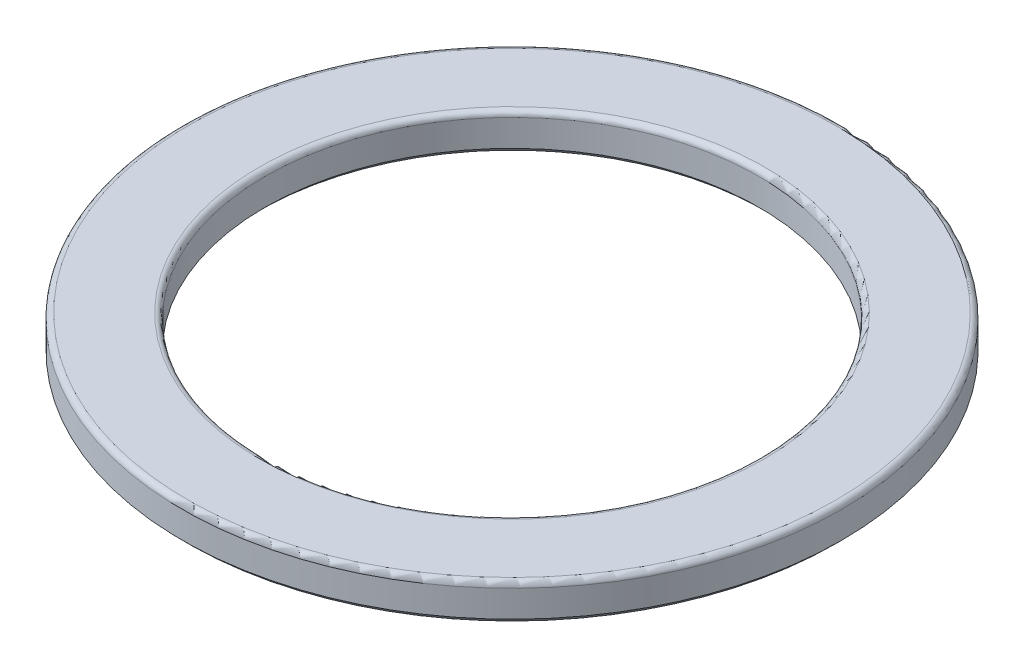
ISO-10303-21;
HEADER;
FILE_DESCRIPTION(('STEP AP214'),'2;1');
FILE_NAME('part.step','',(''),(''),'','','');
FILE_SCHEMA(('AUTOMOTIVE_DESIGN { 1 0 10303 214 1 1 1 1 }'));
ENDSEC;
DATA;
#1=APPLICATION_CONTEXT('core data for automotive mechanical design processes');
#2=APPLICATION_PROTOCOL_DEFINITION('international standard','automotive_design',2000,#1);
#3=PRODUCT_CONTEXT('',#1,'mechanical');
#4=PRODUCT('Part','Part','',(#3));
#5=PRODUCT_RELATED_PRODUCT_CATEGORY('part','',(#4));
#6=PRODUCT_DEFINITION_FORMATION('','',#4);
#7=PRODUCT_DEFINITION_CONTEXT('part definition',#1,'design');
#8=PRODUCT_DEFINITION('design','',#6,#7);
#9=PRODUCT_DEFINITION_SHAPE('','',#8);
#10=(LENGTH_UNIT() NAMED_UNIT(*) SI_UNIT(.MILLI.,.METRE.));
#11=(NAMED_UNIT(*) PLANE_ANGLE_UNIT() SI_UNIT($,.RADIAN.));
#12=(NAMED_UNIT(*) SI_UNIT($,.STERADIAN.) SOLID_ANGLE_UNIT());
#13=UNCERTAINTY_MEASURE_WITH_UNIT(LENGTH_MEASURE(1.E-05),#10,'distance_accuracy_value','');
#14=(GEOMETRIC_REPRESENTATION_CONTEXT(3) GLOBAL_UNCERTAINTY_ASSIGNED_CONTEXT((#13)) GLOBAL_UNIT_ASSIGNED_CONTEXT((#10,
#11,#12)) REPRESENTATION_CONTEXT('',''));
#15=CARTESIAN_POINT('',(0.,0.,0.));
#16=DIRECTION('',(0.,0.,1.));
#17=DIRECTION('',(1.,0.,0.));
#18=AXIS2_PLACEMENT_3D('',#15,#16,#17);
#19=CARTESIAN_POINT('',(52.5,22.,0.));
#20=DIRECTION('',(0.,1.,0.));
#21=DIRECTION('',(-1.,0.,0.));
#22=AXIS2_PLACEMENT_3D('',#19,#20,#21);
#23=PLANE('',#22);
#24=CARTESIAN_POINT('',(0.,22.,0.));
#25=DIRECTION('',(0.,-1.,0.));
#26=DIRECTION('',(1.,0.,0.));
#27=AXIS2_PLACEMENT_3D('',#24,#25,#26);
#28=CIRCLE('',#27,46.);
#29=CARTESIAN_POINT('',(46.,22.,0.));
#30=VERTEX_POINT('',#29);
#31=EDGE_CURVE('E11',#30,#30,#28,.T.);
#32=ORIENTED_EDGE('',*,*,#31,.T.);
#33=EDGE_LOOP('',(#32));
#34=FACE_BOUND('',#33,.T.);
#35=CARTESIAN_POINT('',(0.,22.,0.));
#36=DIRECTION('',(0.,-1.,0.));
#37=DIRECTION('',(1.,0.,0.));
#38=AXIS2_PLACEMENT_3D('',#35,#36,#37);
#39=CIRCLE('',#38,59.);
#40=CARTESIAN_POINT('',(59.,22.,0.));
#41=VERTEX_POINT('',#40);
#42=EDGE_CURVE('E49',#41,#41,#39,.T.);
#43=ORIENTED_EDGE('',*,*,#42,.F.);
#44=EDGE_LOOP('',(#43));
#45=FACE_BOUND('',#44,.T.);
#46=ADVANCED_FACE('F16',(#34,#45),#23,.T.);
#47=CARTESIAN_POINT('',(0.,21.,0.));
#48=DIRECTION('',(0.,-1.,0.));
#49=DIRECTION('',(0.,0.,-1.));
#50=AXIS2_PLACEMENT_3D('',#47,#48,#49);
#51=TOROIDAL_SURFACE('',#50,46.,1.);
#52=CARTESIAN_POINT('',(0.,21.,0.));
#53=DIRECTION('',(0.,-1.,0.));
#54=DIRECTION('',(1.,0.,0.));
#55=AXIS2_PLACEMENT_3D('',#52,#53,#54);
#56=CIRCLE('',#55,45.);
#57=CARTESIAN_POINT('',(45.,21.,0.));
#58=VERTEX_POINT('',#57);
#59=EDGE_CURVE('E25',#58,#58,#56,.T.);
#60=ORIENTED_EDGE('',*,*,#59,.T.);
#61=EDGE_LOOP('',(#60));
#62=FACE_BOUND('',#61,.T.);
#63=ORIENTED_EDGE('',*,*,#31,.F.);
#64=EDGE_LOOP('',(#63));
#65=FACE_BOUND('',#64,.T.);
#66=ADVANCED_FACE('F97',(#62,#65),#51,.T.);
#67=CARTESIAN_POINT('',(0.,18.5638,0.));
#68=DIRECTION('',(0.,1.,0.));
#69=DIRECTION('',(1.,0.,0.));
#70=AXIS2_PLACEMENT_3D('',#67,#68,#69);
#71=CYLINDRICAL_SURFACE('',#70,45.);
#72=CARTESIAN_POINT('',(0.,16.1276,0.));
#73=DIRECTION('',(0.,-1.,0.));
#74=DIRECTION('',(1.,0.,0.));
#75=AXIS2_PLACEMENT_3D('',#72,#73,#74);
#76=CIRCLE('',#75,45.);
#77=CARTESIAN_POINT('',(45.,16.1276,0.));
#78=VERTEX_POINT('',#77);
#79=EDGE_CURVE('E78',#78,#78,#76,.T.);
#80=ORIENTED_EDGE('',*,*,#79,.T.);
#81=EDGE_LOOP('',(#80));
#82=FACE_BOUND('',#81,.T.);
#83=ORIENTED_EDGE('',*,*,#59,.F.);
#84=EDGE_LOOP('',(#83));
#85=FACE_BOUND('',#84,.T.);
#86=ADVANCED_FACE('F84',(#82,#85),#71,.F.);
#87=CARTESIAN_POINT('',(0.,15.6276,0.));
#88=DIRECTION('',(0.,-1.,0.));
#89=DIRECTION('',(1.,0.,0.));
#90=AXIS2_PLACEMENT_3D('',#87,#88,#89);
#91=CONICAL_SURFACE('',#90,45.5,0.785398163397452);
#92=CARTESIAN_POINT('',(0.,15.1276,0.));
#93=DIRECTION('',(0.,-1.,0.));
#94=DIRECTION('',(1.,0.,0.));
#95=AXIS2_PLACEMENT_3D('',#92,#93,#94);
#96=CIRCLE('',#95,46.);
#97=CARTESIAN_POINT('',(46.,15.1276,0.));
#98=VERTEX_POINT('',#97);
#99=EDGE_CURVE('E69',#98,#98,#96,.T.);
#100=ORIENTED_EDGE('',*,*,#99,.T.);
#101=EDGE_LOOP('',(#100));
#102=FACE_BOUND('',#101,.T.);
#103=ORIENTED_EDGE('',*,*,#79,.F.);
#104=EDGE_LOOP('',(#103));
#105=FACE_BOUND('',#104,.T.);
#106=ADVANCED_FACE('F87',(#102,#105),#91,.F.);
#107=CARTESIAN_POINT('',(47.70215,15.1276,0.));
#108=DIRECTION('',(0.,-1.,0.));
#109=DIRECTION('',(1.,0.,0.));
#110=AXIS2_PLACEMENT_3D('',#107,#108,#109);
#111=PLANE('',#110);
#112=CARTESIAN_POINT('',(0.,15.1276,0.));
#113=DIRECTION('',(0.,-1.,0.));
#114=DIRECTION('',(1.,0.,0.));
#115=AXIS2_PLACEMENT_3D('',#112,#113,#114);
#116=CIRCLE('',#115,49.4043);
#117=CARTESIAN_POINT('',(49.4043,15.1276,0.));
#118=VERTEX_POINT('',#117);
#119=EDGE_CURVE('E67',#118,#118,#116,.T.);
#120=ORIENTED_EDGE('',*,*,#119,.T.);
#121=EDGE_LOOP('',(#120));
#122=FACE_BOUND('',#121,.T.);
#123=ORIENTED_EDGE('',*,*,#99,.F.);
#124=EDGE_LOOP('',(#123));
#125=FACE_BOUND('',#124,.T.);
#126=ADVANCED_FACE('F18',(#122,#125),#111,.T.);
#127=CARTESIAN_POINT('',(0.,11.,0.));
#128=DIRECTION('',(0.,-1.,0.));
#129=DIRECTION('',(0.,0.,-1.));
#130=AXIS2_PLACEMENT_3D('',#127,#128,#129);
#131=TOROIDAL_SURFACE('',#130,52.5,5.1595);
#132=CARTESIAN_POINT('',(0.,15.1276,0.));
#133=DIRECTION('',(0.,-1.,0.));
#134=DIRECTION('',(1.,0.,0.));
#135=AXIS2_PLACEMENT_3D('',#132,#133,#134);
#136=CIRCLE('',#135,55.5957);
#137=CARTESIAN_POINT('',(55.5957,15.1276,0.));
#138=VERTEX_POINT('',#137);
#139=EDGE_CURVE('E20',#138,#138,#136,.T.);
#140=ORIENTED_EDGE('',*,*,#139,.T.);
#141=EDGE_LOOP('',(#140));
#142=FACE_BOUND('',#141,.T.);
#143=ORIENTED_EDGE('',*,*,#119,.F.);
#144=EDGE_LOOP('',(#143));
#145=FACE_BOUND('',#144,.T.);
#146=ADVANCED_FACE('F64',(#142,#145),#131,.F.);
#147=CARTESIAN_POINT('',(57.29785,15.1276,0.));
#148=DIRECTION('',(0.,-1.,0.));
#149=DIRECTION('',(1.,0.,0.));
#150=AXIS2_PLACEMENT_3D('',#147,#148,#149);
#151=PLANE('',#150);
#152=CARTESIAN_POINT('',(0.,15.1276,0.));
#153=DIRECTION('',(0.,-1.,0.));
#154=DIRECTION('',(1.,0.,0.));
#155=AXIS2_PLACEMENT_3D('',#152,#153,#154);
#156=CIRCLE('',#155,59.);
#157=CARTESIAN_POINT('',(59.,15.1276,0.));
#158=VERTEX_POINT('',#157);
#159=EDGE_CURVE('E68',#158,#158,#156,.T.);
#160=ORIENTED_EDGE('',*,*,#159,.T.);
#161=EDGE_LOOP('',(#160));
#162=FACE_BOUND('',#161,.T.);
#163=ORIENTED_EDGE('',*,*,#139,.F.);
#164=EDGE_LOOP('',(#163));
#165=FACE_BOUND('',#164,.T.);
#166=ADVANCED_FACE('F115',(#162,#165),#151,.T.);
#167=CARTESIAN_POINT('',(0.,15.6276,0.));
#168=DIRECTION('',(0.,1.,0.));
#169=DIRECTION('',(1.,0.,0.));
#170=AXIS2_PLACEMENT_3D('',#167,#168,#169);
#171=CONICAL_SURFACE('',#170,59.5,0.785398163397445);
#172=CARTESIAN_POINT('',(0.,16.1276,0.));
#173=DIRECTION('',(0.,-1.,0.));
#174=DIRECTION('',(1.,0.,0.));
#175=AXIS2_PLACEMENT_3D('',#172,#173,#174);
#176=CIRCLE('',#175,60.);
#177=CARTESIAN_POINT('',(60.,16.1276,0.));
#178=VERTEX_POINT('',#177);
#179=EDGE_CURVE('E71',#178,#178,#176,.T.);
#180=ORIENTED_EDGE('',*,*,#179,.T.);
#181=EDGE_LOOP('',(#180));
#182=FACE_BOUND('',#181,.T.);
#183=ORIENTED_EDGE('',*,*,#159,.F.);
#184=EDGE_LOOP('',(#183));
#185=FACE_BOUND('',#184,.T.);
#186=ADVANCED_FACE('F114',(#182,#185),#171,.T.);
#187=CARTESIAN_POINT('',(0.,18.5638,0.));
#188=DIRECTION('',(0.,1.,0.));
#189=DIRECTION('',(1.,0.,0.));
#190=AXIS2_PLACEMENT_3D('',#187,#188,#189);
#191=CYLINDRICAL_SURFACE('',#190,60.);
#192=CARTESIAN_POINT('',(0.,21.,0.));
#193=DIRECTION('',(0.,-1.,0.));
#194=DIRECTION('',(1.,0.,0.));
#195=AXIS2_PLACEMENT_3D('',#192,#193,#194);
#196=CIRCLE('',#195,60.);
#197=CARTESIAN_POINT('',(60.,21.,0.));
#198=VERTEX_POINT('',#197);
#199=EDGE_CURVE('E45',#198,#198,#196,.T.);
#200=ORIENTED_EDGE('',*,*,#199,.T.);
#201=EDGE_LOOP('',(#200));
#202=FACE_BOUND('',#201,.T.);
#203=ORIENTED_EDGE('',*,*,#179,.F.);
#204=EDGE_LOOP('',(#203));
#205=FACE_BOUND('',#204,.T.);
#206=ADVANCED_FACE('F111',(#202,#205),#191,.T.);
#207=CARTESIAN_POINT('',(0.,21.,0.));
#208=DIRECTION('',(0.,-1.,0.));
#209=DIRECTION('',(0.,0.,-1.));
#210=AXIS2_PLACEMENT_3D('',#207,#208,#209);
#211=TOROIDAL_SURFACE('',#210,59.,1.);
#212=ORIENTED_EDGE('',*,*,#42,.T.);
#213=EDGE_LOOP('',(#212));
#214=FACE_BOUND('',#213,.T.);
#215=ORIENTED_EDGE('',*,*,#199,.F.);
#216=EDGE_LOOP('',(#215));
#217=FACE_BOUND('',#216,.T.);
#218=ADVANCED_FACE('F108',(#214,#217),#211,.T.);
#219=CLOSED_SHELL('',(#46,#66,#86,#106,#126,#146,#166,#186,#206,#218));
#220=MANIFOLD_SOLID_BREP('B1',#219);
#221=ADVANCED_BREP_SHAPE_REPRESENTATION('',(#18,#220),#14);
#222=SHAPE_DEFINITION_REPRESENTATION(#9,#221);
ENDSEC;
END-ISO-10303-21;
